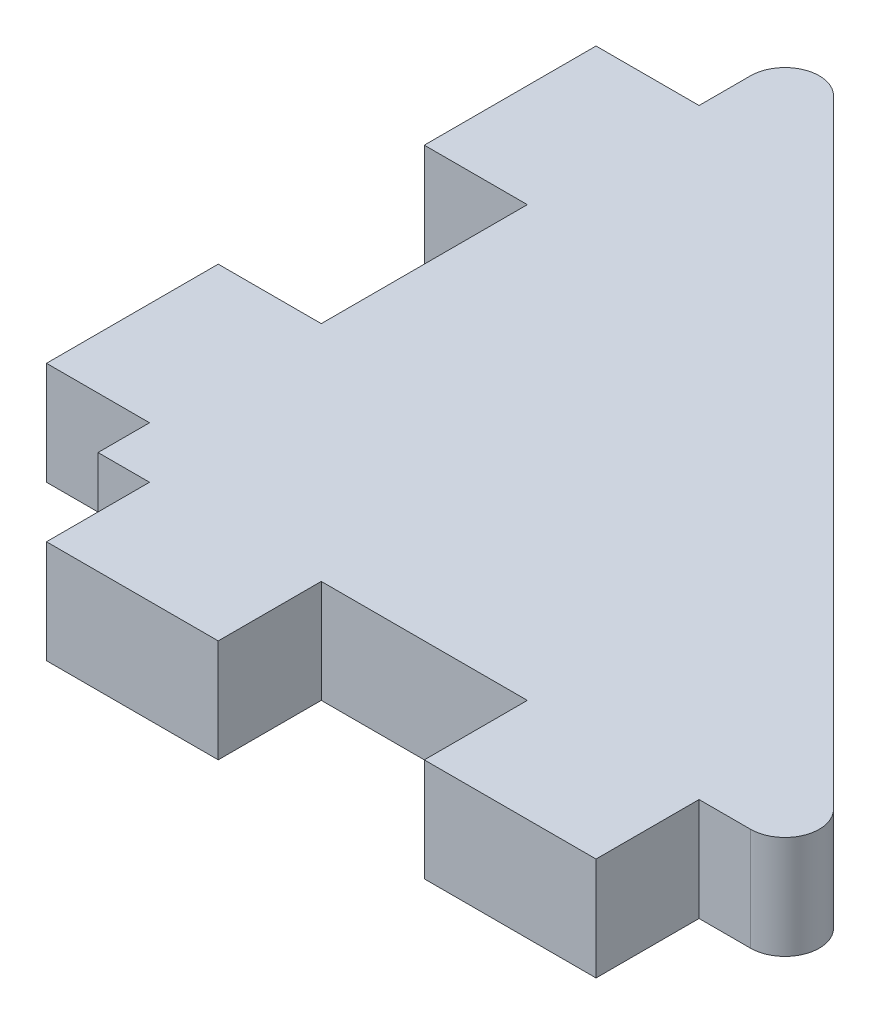
ISO-10303-21;
HEADER;
FILE_DESCRIPTION(('STEP AP214'),'2;1');
FILE_NAME('part.step','',(''),(''),'','','');
FILE_SCHEMA(('AUTOMOTIVE_DESIGN { 1 0 10303 214 1 1 1 1 }'));
ENDSEC;
DATA;
#1=APPLICATION_CONTEXT('core data for automotive mechanical design processes');
#2=APPLICATION_PROTOCOL_DEFINITION('international standard','automotive_design',2000,#1);
#3=PRODUCT_CONTEXT('',#1,'mechanical');
#4=PRODUCT('Part','Part','',(#3));
#5=PRODUCT_RELATED_PRODUCT_CATEGORY('part','',(#4));
#6=PRODUCT_DEFINITION_FORMATION('','',#4);
#7=PRODUCT_DEFINITION_CONTEXT('part definition',#1,'design');
#8=PRODUCT_DEFINITION('design','',#6,#7);
#9=PRODUCT_DEFINITION_SHAPE('','',#8);
#10=(LENGTH_UNIT() NAMED_UNIT(*) SI_UNIT(.MILLI.,.METRE.));
#11=(NAMED_UNIT(*) PLANE_ANGLE_UNIT() SI_UNIT($,.RADIAN.));
#12=(NAMED_UNIT(*) SI_UNIT($,.STERADIAN.) SOLID_ANGLE_UNIT());
#13=UNCERTAINTY_MEASURE_WITH_UNIT(LENGTH_MEASURE(1.E-05),#10,'distance_accuracy_value','');
#14=(GEOMETRIC_REPRESENTATION_CONTEXT(3) GLOBAL_UNCERTAINTY_ASSIGNED_CONTEXT((#13)) GLOBAL_UNIT_ASSIGNED_CONTEXT((#10,
#11,#12)) REPRESENTATION_CONTEXT('',''));
#15=CARTESIAN_POINT('',(0.,0.,0.));
#16=DIRECTION('',(0.,0.,1.));
#17=DIRECTION('',(1.,0.,0.));
#18=AXIS2_PLACEMENT_3D('',#15,#16,#17);
#19=CARTESIAN_POINT('',(-42.4131209888281,6.,17.2673155352754));
#20=DIRECTION('',(1.,0.,0.));
#21=DIRECTION('',(0.,0.,-1.));
#22=AXIS2_PLACEMENT_3D('',#19,#20,#21);
#23=PLANE('',#22);
#24=DIRECTION('',(0.,0.,1.));
#25=VECTOR('',#24,1.);
#26=CARTESIAN_POINT('',(-42.4131209888281,0.,17.2673155352754));
#27=LINE('',#26,#25);
#28=CARTESIAN_POINT('',(-42.4131209888281,0.,17.2673155352754));
#29=VERTEX_POINT('',#28);
#30=CARTESIAN_POINT('',(-42.4131209888281,0.,20.2673155352754));
#31=VERTEX_POINT('',#30);
#32=EDGE_CURVE('E218',#29,#31,#27,.T.);
#33=ORIENTED_EDGE('',*,*,#32,.T.);
#34=DIRECTION('',(0.,-1.,0.));
#35=VECTOR('',#34,1.);
#36=CARTESIAN_POINT('',(-42.4131209888281,6.,20.2673155352754));
#37=LINE('',#36,#35);
#38=CARTESIAN_POINT('',(-42.4131209888281,6.,20.2673155352754));
#39=VERTEX_POINT('',#38);
#40=EDGE_CURVE('E11',#39,#31,#37,.T.);
#41=ORIENTED_EDGE('',*,*,#40,.F.);
#42=DIRECTION('',(0.,0.,1.));
#43=VECTOR('',#42,1.);
#44=CARTESIAN_POINT('',(-42.4131209888281,6.,17.2673155352754));
#45=LINE('',#44,#43);
#46=CARTESIAN_POINT('',(-42.4131209888281,6.,17.2673155352754));
#47=VERTEX_POINT('',#46);
#48=EDGE_CURVE('E279',#47,#39,#45,.T.);
#49=ORIENTED_EDGE('',*,*,#48,.F.);
#50=DIRECTION('',(0.,-1.,0.));
#51=VECTOR('',#50,1.);
#52=CARTESIAN_POINT('',(-42.4131209888281,6.,17.2673155352754));
#53=LINE('',#52,#51);
#54=EDGE_CURVE('E214',#47,#29,#53,.T.);
#55=ORIENTED_EDGE('',*,*,#54,.T.);
#56=EDGE_LOOP('',(#33,#41,#49,#55));
#57=FACE_BOUND('',#56,.T.);
#58=ADVANCED_FACE('F39',(#57),#23,.F.);
#59=CARTESIAN_POINT('',(-42.4131209888281,6.,20.2673155352754));
#60=DIRECTION('',(0.,0.,-1.));
#61=DIRECTION('',(-1.,0.,0.));
#62=AXIS2_PLACEMENT_3D('',#59,#60,#61);
#63=PLANE('',#62);
#64=DIRECTION('',(1.,0.,0.));
#65=VECTOR('',#64,1.);
#66=CARTESIAN_POINT('',(-42.4131209888281,0.,20.2673155352754));
#67=LINE('',#66,#65);
#68=CARTESIAN_POINT('',(-39.4131209888281,0.,20.2673155352754));
#69=VERTEX_POINT('',#68);
#70=EDGE_CURVE('E222',#31,#69,#67,.T.);
#71=ORIENTED_EDGE('',*,*,#70,.T.);
#72=DIRECTION('',(0.,-1.,0.));
#73=VECTOR('',#72,1.);
#74=CARTESIAN_POINT('',(-39.4131209888281,6.,20.2673155352754));
#75=LINE('',#74,#73);
#76=CARTESIAN_POINT('',(-39.4131209888281,6.,20.2673155352754));
#77=VERTEX_POINT('',#76);
#78=EDGE_CURVE('E48',#77,#69,#75,.T.);
#79=ORIENTED_EDGE('',*,*,#78,.F.);
#80=DIRECTION('',(1.,0.,0.));
#81=VECTOR('',#80,1.);
#82=CARTESIAN_POINT('',(-42.4131209888281,6.,20.2673155352754));
#83=LINE('',#82,#81);
#84=EDGE_CURVE('E138',#39,#77,#83,.T.);
#85=ORIENTED_EDGE('',*,*,#84,.F.);
#86=ORIENTED_EDGE('',*,*,#40,.T.);
#87=EDGE_LOOP('',(#71,#79,#85,#86));
#88=FACE_BOUND('',#87,.T.);
#89=ADVANCED_FACE('F436',(#88),#63,.F.);
#90=CARTESIAN_POINT('',(-39.4131209888281,6.,20.2673155352754));
#91=DIRECTION('',(1.,0.,0.));
#92=DIRECTION('',(0.,0.,-1.));
#93=AXIS2_PLACEMENT_3D('',#90,#91,#92);
#94=PLANE('',#93);
#95=DIRECTION('',(0.,0.,1.));
#96=VECTOR('',#95,1.);
#97=CARTESIAN_POINT('',(-39.4131209888281,0.,20.2673155352754));
#98=LINE('',#97,#96);
#99=CARTESIAN_POINT('',(-39.4131209888281,0.,26.2673155352754));
#100=VERTEX_POINT('',#99);
#101=EDGE_CURVE('E225',#69,#100,#98,.T.);
#102=ORIENTED_EDGE('',*,*,#101,.T.);
#103=DIRECTION('',(0.,-1.,0.));
#104=VECTOR('',#103,1.);
#105=CARTESIAN_POINT('',(-39.4131209888281,6.,26.2673155352754));
#106=LINE('',#105,#104);
#107=CARTESIAN_POINT('',(-39.4131209888281,6.,26.2673155352754));
#108=VERTEX_POINT('',#107);
#109=EDGE_CURVE('E342',#108,#100,#106,.T.);
#110=ORIENTED_EDGE('',*,*,#109,.F.);
#111=DIRECTION('',(0.,0.,1.));
#112=VECTOR('',#111,1.);
#113=CARTESIAN_POINT('',(-39.4131209888281,6.,20.2673155352754));
#114=LINE('',#113,#112);
#115=EDGE_CURVE('E352',#77,#108,#114,.T.);
#116=ORIENTED_EDGE('',*,*,#115,.F.);
#117=ORIENTED_EDGE('',*,*,#78,.T.);
#118=EDGE_LOOP('',(#102,#110,#116,#117));
#119=FACE_BOUND('',#118,.T.);
#120=ADVANCED_FACE('F350',(#119),#94,.F.);
#121=CARTESIAN_POINT('',(-39.4131209888281,6.,26.2673155352754));
#122=DIRECTION('',(0.,0.,-1.));
#123=DIRECTION('',(-1.,0.,0.));
#124=AXIS2_PLACEMENT_3D('',#121,#122,#123);
#125=PLANE('',#124);
#126=DIRECTION('',(1.,0.,0.));
#127=VECTOR('',#126,1.);
#128=CARTESIAN_POINT('',(-39.4131209888281,0.,26.2673155352754));
#129=LINE('',#128,#127);
#130=CARTESIAN_POINT('',(-29.4131209888281,0.,26.2673155352754));
#131=VERTEX_POINT('',#130);
#132=EDGE_CURVE('E228',#100,#131,#129,.T.);
#133=ORIENTED_EDGE('',*,*,#132,.T.);
#134=DIRECTION('',(0.,-1.,0.));
#135=VECTOR('',#134,1.);
#136=CARTESIAN_POINT('',(-29.4131209888281,6.,26.2673155352754));
#137=LINE('',#136,#135);
#138=CARTESIAN_POINT('',(-29.4131209888281,6.,26.2673155352754));
#139=VERTEX_POINT('',#138);
#140=EDGE_CURVE('E338',#139,#131,#137,.T.);
#141=ORIENTED_EDGE('',*,*,#140,.F.);
#142=DIRECTION('',(1.,0.,0.));
#143=VECTOR('',#142,1.);
#144=CARTESIAN_POINT('',(-39.4131209888281,6.,26.2673155352754));
#145=LINE('',#144,#143);
#146=EDGE_CURVE('E371',#108,#139,#145,.T.);
#147=ORIENTED_EDGE('',*,*,#146,.F.);
#148=ORIENTED_EDGE('',*,*,#109,.T.);
#149=EDGE_LOOP('',(#133,#141,#147,#148));
#150=FACE_BOUND('',#149,.T.);
#151=ADVANCED_FACE('F361',(#150),#125,.F.);
#152=CARTESIAN_POINT('',(-29.4131209888281,6.,20.2673155352754));
#153=DIRECTION('',(-1.,0.,0.));
#154=DIRECTION('',(0.,0.,1.));
#155=AXIS2_PLACEMENT_3D('',#152,#153,#154);
#156=PLANE('',#155);
#157=DIRECTION('',(0.,0.,-1.));
#158=VECTOR('',#157,1.);
#159=CARTESIAN_POINT('',(-29.4131209888281,0.,20.2673155352754));
#160=LINE('',#159,#158);
#161=CARTESIAN_POINT('',(-29.4131209888281,0.,20.2673155352754));
#162=VERTEX_POINT('',#161);
#163=EDGE_CURVE('E231',#131,#162,#160,.T.);
#164=ORIENTED_EDGE('',*,*,#163,.T.);
#165=DIRECTION('',(0.,-1.,0.));
#166=VECTOR('',#165,1.);
#167=CARTESIAN_POINT('',(-29.4131209888281,6.,20.2673155352754));
#168=LINE('',#167,#166);
#169=CARTESIAN_POINT('',(-29.4131209888281,6.,20.2673155352754));
#170=VERTEX_POINT('',#169);
#171=EDGE_CURVE('E334',#170,#162,#168,.T.);
#172=ORIENTED_EDGE('',*,*,#171,.F.);
#173=DIRECTION('',(0.,0.,-1.));
#174=VECTOR('',#173,1.);
#175=CARTESIAN_POINT('',(-29.4131209888281,6.,20.2673155352754));
#176=LINE('',#175,#174);
#177=EDGE_CURVE('E367',#139,#170,#176,.T.);
#178=ORIENTED_EDGE('',*,*,#177,.F.);
#179=ORIENTED_EDGE('',*,*,#140,.T.);
#180=EDGE_LOOP('',(#164,#172,#178,#179));
#181=FACE_BOUND('',#180,.T.);
#182=ADVANCED_FACE('F365',(#181),#156,.F.);
#183=CARTESIAN_POINT('',(-29.4131209888281,6.,20.2673155352754));
#184=DIRECTION('',(0.,0.,-1.));
#185=DIRECTION('',(-1.,0.,0.));
#186=AXIS2_PLACEMENT_3D('',#183,#184,#185);
#187=PLANE('',#186);
#188=DIRECTION('',(1.,0.,0.));
#189=VECTOR('',#188,1.);
#190=CARTESIAN_POINT('',(-29.4131209888281,0.,20.2673155352754));
#191=LINE('',#190,#189);
#192=CARTESIAN_POINT('',(-17.4131209888281,0.,20.2673155352754));
#193=VERTEX_POINT('',#192);
#194=EDGE_CURVE('E234',#162,#193,#191,.T.);
#195=ORIENTED_EDGE('',*,*,#194,.T.);
#196=DIRECTION('',(0.,-1.,0.));
#197=VECTOR('',#196,1.);
#198=CARTESIAN_POINT('',(-17.4131209888281,6.,20.2673155352754));
#199=LINE('',#198,#197);
#200=CARTESIAN_POINT('',(-17.4131209888281,6.,20.2673155352754));
#201=VERTEX_POINT('',#200);
#202=EDGE_CURVE('E330',#201,#193,#199,.T.);
#203=ORIENTED_EDGE('',*,*,#202,.F.);
#204=DIRECTION('',(1.,0.,0.));
#205=VECTOR('',#204,1.);
#206=CARTESIAN_POINT('',(-29.4131209888281,6.,20.2673155352754));
#207=LINE('',#206,#205);
#208=EDGE_CURVE('E370',#170,#201,#207,.T.);
#209=ORIENTED_EDGE('',*,*,#208,.F.);
#210=ORIENTED_EDGE('',*,*,#171,.T.);
#211=EDGE_LOOP('',(#195,#203,#209,#210));
#212=FACE_BOUND('',#211,.T.);
#213=ADVANCED_FACE('F449',(#212),#187,.F.);
#214=CARTESIAN_POINT('',(-17.4131209888281,6.,20.2673155352754));
#215=DIRECTION('',(1.,0.,0.));
#216=DIRECTION('',(0.,0.,-1.));
#217=AXIS2_PLACEMENT_3D('',#214,#215,#216);
#218=PLANE('',#217);
#219=DIRECTION('',(0.,0.,1.));
#220=VECTOR('',#219,1.);
#221=CARTESIAN_POINT('',(-17.4131209888281,0.,20.2673155352754));
#222=LINE('',#221,#220);
#223=CARTESIAN_POINT('',(-17.4131209888281,0.,26.2673155352754));
#224=VERTEX_POINT('',#223);
#225=EDGE_CURVE('E237',#193,#224,#222,.T.);
#226=ORIENTED_EDGE('',*,*,#225,.T.);
#227=DIRECTION('',(0.,-1.,0.));
#228=VECTOR('',#227,1.);
#229=CARTESIAN_POINT('',(-17.4131209888281,6.,26.2673155352754));
#230=LINE('',#229,#228);
#231=CARTESIAN_POINT('',(-17.4131209888281,6.,26.2673155352754));
#232=VERTEX_POINT('',#231);
#233=EDGE_CURVE('E326',#232,#224,#230,.T.);
#234=ORIENTED_EDGE('',*,*,#233,.F.);
#235=DIRECTION('',(0.,0.,1.));
#236=VECTOR('',#235,1.);
#237=CARTESIAN_POINT('',(-17.4131209888281,6.,20.2673155352754));
#238=LINE('',#237,#236);
#239=EDGE_CURVE('E375',#201,#232,#238,.T.);
#240=ORIENTED_EDGE('',*,*,#239,.F.);
#241=ORIENTED_EDGE('',*,*,#202,.T.);
#242=EDGE_LOOP('',(#226,#234,#240,#241));
#243=FACE_BOUND('',#242,.T.);
#244=ADVANCED_FACE('F452',(#243),#218,.F.);
#245=CARTESIAN_POINT('',(-17.4131209888281,6.,26.2673155352754));
#246=DIRECTION('',(0.,0.,-1.));
#247=DIRECTION('',(-1.,0.,0.));
#248=AXIS2_PLACEMENT_3D('',#245,#246,#247);
#249=PLANE('',#248);
#250=DIRECTION('',(1.,0.,0.));
#251=VECTOR('',#250,1.);
#252=CARTESIAN_POINT('',(-17.4131209888281,0.,26.2673155352754));
#253=LINE('',#252,#251);
#254=CARTESIAN_POINT('',(-7.41312098882813,0.,26.2673155352754));
#255=VERTEX_POINT('',#254);
#256=EDGE_CURVE('E240',#224,#255,#253,.T.);
#257=ORIENTED_EDGE('',*,*,#256,.T.);
#258=DIRECTION('',(0.,-1.,0.));
#259=VECTOR('',#258,1.);
#260=CARTESIAN_POINT('',(-7.41312098882813,6.,26.2673155352754));
#261=LINE('',#260,#259);
#262=CARTESIAN_POINT('',(-7.41312098882813,6.,26.2673155352754));
#263=VERTEX_POINT('',#262);
#264=EDGE_CURVE('E322',#263,#255,#261,.T.);
#265=ORIENTED_EDGE('',*,*,#264,.F.);
#266=DIRECTION('',(1.,0.,0.));
#267=VECTOR('',#266,1.);
#268=CARTESIAN_POINT('',(-17.4131209888281,6.,26.2673155352754));
#269=LINE('',#268,#267);
#270=EDGE_CURVE('E382',#232,#263,#269,.T.);
#271=ORIENTED_EDGE('',*,*,#270,.F.);
#272=ORIENTED_EDGE('',*,*,#233,.T.);
#273=EDGE_LOOP('',(#257,#265,#271,#272));
#274=FACE_BOUND('',#273,.T.);
#275=ADVANCED_FACE('F456',(#274),#249,.F.);
#276=CARTESIAN_POINT('',(-7.41312098882812,6.,20.2673155352754));
#277=DIRECTION('',(-1.,0.,0.));
#278=DIRECTION('',(0.,0.,1.));
#279=AXIS2_PLACEMENT_3D('',#276,#277,#278);
#280=PLANE('',#279);
#281=DIRECTION('',(0.,0.,-1.));
#282=VECTOR('',#281,1.);
#283=CARTESIAN_POINT('',(-7.41312098882812,0.,20.2673155352754));
#284=LINE('',#283,#282);
#285=CARTESIAN_POINT('',(-7.41312098882812,0.,20.2673155352754));
#286=VERTEX_POINT('',#285);
#287=EDGE_CURVE('E243',#255,#286,#284,.T.);
#288=ORIENTED_EDGE('',*,*,#287,.T.);
#289=DIRECTION('',(0.,-1.,0.));
#290=VECTOR('',#289,1.);
#291=CARTESIAN_POINT('',(-7.41312098882812,6.,20.2673155352754));
#292=LINE('',#291,#290);
#293=CARTESIAN_POINT('',(-7.41312098882812,6.,20.2673155352754));
#294=VERTEX_POINT('',#293);
#295=EDGE_CURVE('E318',#294,#286,#292,.T.);
#296=ORIENTED_EDGE('',*,*,#295,.F.);
#297=DIRECTION('',(0.,0.,-1.));
#298=VECTOR('',#297,1.);
#299=CARTESIAN_POINT('',(-7.41312098882812,6.,20.2673155352754));
#300=LINE('',#299,#298);
#301=EDGE_CURVE('E385',#263,#294,#300,.T.);
#302=ORIENTED_EDGE('',*,*,#301,.F.);
#303=ORIENTED_EDGE('',*,*,#264,.T.);
#304=EDGE_LOOP('',(#288,#296,#302,#303));
#305=FACE_BOUND('',#304,.T.);
#306=ADVANCED_FACE('F460',(#305),#280,.F.);
#307=CARTESIAN_POINT('',(-7.41312098882812,6.,20.2673155352754));
#308=DIRECTION('',(0.,0.,-1.));
#309=DIRECTION('',(-1.,0.,0.));
#310=AXIS2_PLACEMENT_3D('',#307,#308,#309);
#311=PLANE('',#310);
#312=DIRECTION('',(1.,0.,0.));
#313=VECTOR('',#312,1.);
#314=CARTESIAN_POINT('',(-7.41312098882812,0.,20.2673155352754));
#315=LINE('',#314,#313);
#316=CARTESIAN_POINT('',(-4.41312098882813,0.,20.2673155352754));
#317=VERTEX_POINT('',#316);
#318=EDGE_CURVE('E246',#286,#317,#315,.T.);
#319=ORIENTED_EDGE('',*,*,#318,.T.);
#320=DIRECTION('',(0.,-1.,0.));
#321=VECTOR('',#320,1.);
#322=CARTESIAN_POINT('',(-4.41312098882813,6.,20.2673155352754));
#323=LINE('',#322,#321);
#324=CARTESIAN_POINT('',(-4.41312098882813,6.,20.2673155352754));
#325=VERTEX_POINT('',#324);
#326=EDGE_CURVE('E314',#325,#317,#323,.T.);
#327=ORIENTED_EDGE('',*,*,#326,.F.);
#328=DIRECTION('',(1.,0.,0.));
#329=VECTOR('',#328,1.);
#330=CARTESIAN_POINT('',(-7.41312098882812,6.,20.2673155352754));
#331=LINE('',#330,#329);
#332=EDGE_CURVE('E388',#294,#325,#331,.T.);
#333=ORIENTED_EDGE('',*,*,#332,.F.);
#334=ORIENTED_EDGE('',*,*,#295,.T.);
#335=EDGE_LOOP('',(#319,#327,#333,#334));
#336=FACE_BOUND('',#335,.T.);
#337=ADVANCED_FACE('F464',(#336),#311,.F.);
#338=CARTESIAN_POINT('',(-4.41312098882813,6.,18.2673155352754));
#339=DIRECTION('',(0.,-1.,0.));
#340=DIRECTION('',(0.,0.,-1.));
#341=AXIS2_PLACEMENT_3D('',#338,#339,#340);
#342=CYLINDRICAL_SURFACE('',#341,2.);
#343=CARTESIAN_POINT('',(-4.41312098882813,0.,18.2673155352754));
#344=DIRECTION('',(0.,1.,0.));
#345=DIRECTION('',(0.,0.,1.));
#346=AXIS2_PLACEMENT_3D('',#343,#344,#345);
#347=CIRCLE('',#346,2.);
#348=CARTESIAN_POINT('',(-2.99890742645503,0.,16.8531019729023));
#349=VERTEX_POINT('',#348);
#350=EDGE_CURVE('E249',#317,#349,#347,.T.);
#351=ORIENTED_EDGE('',*,*,#350,.T.);
#352=DIRECTION('',(0.,-1.,0.));
#353=VECTOR('',#352,1.);
#354=CARTESIAN_POINT('',(-2.99890742645503,6.,16.8531019729023));
#355=LINE('',#354,#353);
#356=CARTESIAN_POINT('',(-2.99890742645503,6.,16.8531019729023));
#357=VERTEX_POINT('',#356);
#358=EDGE_CURVE('E310',#357,#349,#355,.T.);
#359=ORIENTED_EDGE('',*,*,#358,.F.);
#360=CARTESIAN_POINT('',(-4.41312098882813,6.,18.2673155352754));
#361=DIRECTION('',(0.,1.,0.));
#362=DIRECTION('',(0.,0.,1.));
#363=AXIS2_PLACEMENT_3D('',#360,#361,#362);
#364=CIRCLE('',#363,2.);
#365=EDGE_CURVE('E391',#325,#357,#364,.T.);
#366=ORIENTED_EDGE('',*,*,#365,.F.);
#367=ORIENTED_EDGE('',*,*,#326,.T.);
#368=EDGE_LOOP('',(#351,#359,#366,#367));
#369=FACE_BOUND('',#368,.T.);
#370=ADVANCED_FACE('F468',(#369),#342,.T.);
#371=CARTESIAN_POINT('',(-38.998907426455,6.,-19.1468980270977));
#372=DIRECTION('',(-0.707106781186548,0.,0.707106781186548));
#373=DIRECTION('',(0.707106781186548,0.,0.707106781186548));
#374=AXIS2_PLACEMENT_3D('',#371,#372,#373);
#375=PLANE('',#374);
#376=DIRECTION('',(-0.707106781186547,0.,-0.707106781186547));
#377=VECTOR('',#376,1.);
#378=CARTESIAN_POINT('',(-38.998907426455,0.,-19.1468980270977));
#379=LINE('',#378,#377);
#380=CARTESIAN_POINT('',(-38.998907426455,0.,-19.1468980270977));
#381=VERTEX_POINT('',#380);
#382=EDGE_CURVE('E252',#349,#381,#379,.T.);
#383=ORIENTED_EDGE('',*,*,#382,.T.);
#384=DIRECTION('',(0.,-1.,0.));
#385=VECTOR('',#384,1.);
#386=CARTESIAN_POINT('',(-38.998907426455,6.,-19.1468980270977));
#387=LINE('',#386,#385);
#388=CARTESIAN_POINT('',(-38.998907426455,6.,-19.1468980270977));
#389=VERTEX_POINT('',#388);
#390=EDGE_CURVE('E306',#389,#381,#387,.T.);
#391=ORIENTED_EDGE('',*,*,#390,.F.);
#392=DIRECTION('',(-0.707106781186547,0.,-0.707106781186547));
#393=VECTOR('',#392,1.);
#394=CARTESIAN_POINT('',(-38.998907426455,6.,-19.1468980270977));
#395=LINE('',#394,#393);
#396=EDGE_CURVE('E394',#357,#389,#395,.T.);
#397=ORIENTED_EDGE('',*,*,#396,.F.);
#398=ORIENTED_EDGE('',*,*,#358,.T.);
#399=EDGE_LOOP('',(#383,#391,#397,#398));
#400=FACE_BOUND('',#399,.T.);
#401=ADVANCED_FACE('F472',(#400),#375,.F.);
#402=CARTESIAN_POINT('',(-40.4131209888281,6.,-17.7326844647246));
#403=DIRECTION('',(0.,-1.,0.));
#404=DIRECTION('',(0.,0.,-1.));
#405=AXIS2_PLACEMENT_3D('',#402,#403,#404);
#406=CYLINDRICAL_SURFACE('',#405,2.);
#407=CARTESIAN_POINT('',(-40.4131209888281,0.,-17.7326844647246));
#408=DIRECTION('',(0.,1.,0.));
#409=DIRECTION('',(0.,0.,1.));
#410=AXIS2_PLACEMENT_3D('',#407,#408,#409);
#411=CIRCLE('',#410,2.);
#412=CARTESIAN_POINT('',(-42.4131209888281,0.,-17.7326844647246));
#413=VERTEX_POINT('',#412);
#414=EDGE_CURVE('E255',#381,#413,#411,.T.);
#415=ORIENTED_EDGE('',*,*,#414,.T.);
#416=DIRECTION('',(0.,-1.,0.));
#417=VECTOR('',#416,1.);
#418=CARTESIAN_POINT('',(-42.4131209888281,6.,-17.7326844647246));
#419=LINE('',#418,#417);
#420=CARTESIAN_POINT('',(-42.4131209888281,6.,-17.7326844647246));
#421=VERTEX_POINT('',#420);
#422=EDGE_CURVE('E302',#421,#413,#419,.T.);
#423=ORIENTED_EDGE('',*,*,#422,.F.);
#424=CARTESIAN_POINT('',(-40.4131209888281,6.,-17.7326844647246));
#425=DIRECTION('',(0.,1.,0.));
#426=DIRECTION('',(0.,0.,1.));
#427=AXIS2_PLACEMENT_3D('',#424,#425,#426);
#428=CIRCLE('',#427,2.);
#429=EDGE_CURVE('E397',#389,#421,#428,.T.);
#430=ORIENTED_EDGE('',*,*,#429,.F.);
#431=ORIENTED_EDGE('',*,*,#390,.T.);
#432=EDGE_LOOP('',(#415,#423,#430,#431));
#433=FACE_BOUND('',#432,.T.);
#434=ADVANCED_FACE('F476',(#433),#406,.T.);
#435=CARTESIAN_POINT('',(-42.4131209888281,6.,-17.7326844647246));
#436=DIRECTION('',(1.,0.,0.));
#437=DIRECTION('',(0.,0.,-1.));
#438=AXIS2_PLACEMENT_3D('',#435,#436,#437);
#439=PLANE('',#438);
#440=DIRECTION('',(0.,0.,1.));
#441=VECTOR('',#440,1.);
#442=CARTESIAN_POINT('',(-42.4131209888281,0.,-17.7326844647246));
#443=LINE('',#442,#441);
#444=CARTESIAN_POINT('',(-42.4131209888281,0.,-14.7326844647246));
#445=VERTEX_POINT('',#444);
#446=EDGE_CURVE('E258',#413,#445,#443,.T.);
#447=ORIENTED_EDGE('',*,*,#446,.T.);
#448=DIRECTION('',(0.,-1.,0.));
#449=VECTOR('',#448,1.);
#450=CARTESIAN_POINT('',(-42.4131209888281,6.,-14.7326844647246));
#451=LINE('',#450,#449);
#452=CARTESIAN_POINT('',(-42.4131209888281,6.,-14.7326844647246));
#453=VERTEX_POINT('',#452);
#454=EDGE_CURVE('E298',#453,#445,#451,.T.);
#455=ORIENTED_EDGE('',*,*,#454,.F.);
#456=DIRECTION('',(0.,0.,1.));
#457=VECTOR('',#456,1.);
#458=CARTESIAN_POINT('',(-42.4131209888281,6.,-17.7326844647246));
#459=LINE('',#458,#457);
#460=EDGE_CURVE('E400',#421,#453,#459,.T.);
#461=ORIENTED_EDGE('',*,*,#460,.F.);
#462=ORIENTED_EDGE('',*,*,#422,.T.);
#463=EDGE_LOOP('',(#447,#455,#461,#462));
#464=FACE_BOUND('',#463,.T.);
#465=ADVANCED_FACE('F480',(#464),#439,.F.);
#466=CARTESIAN_POINT('',(-42.4131209888281,6.,-14.7326844647246));
#467=DIRECTION('',(0.,0.,1.));
#468=DIRECTION('',(1.,0.,0.));
#469=AXIS2_PLACEMENT_3D('',#466,#467,#468);
#470=PLANE('',#469);
#471=DIRECTION('',(-1.,0.,0.));
#472=VECTOR('',#471,1.);
#473=CARTESIAN_POINT('',(-42.4131209888281,0.,-14.7326844647246));
#474=LINE('',#473,#472);
#475=CARTESIAN_POINT('',(-48.4131209888281,0.,-14.7326844647246));
#476=VERTEX_POINT('',#475);
#477=EDGE_CURVE('E261',#445,#476,#474,.T.);
#478=ORIENTED_EDGE('',*,*,#477,.T.);
#479=DIRECTION('',(0.,-1.,0.));
#480=VECTOR('',#479,1.);
#481=CARTESIAN_POINT('',(-48.4131209888281,6.,-14.7326844647246));
#482=LINE('',#481,#480);
#483=CARTESIAN_POINT('',(-48.4131209888281,6.,-14.7326844647246));
#484=VERTEX_POINT('',#483);
#485=EDGE_CURVE('E294',#484,#476,#482,.T.);
#486=ORIENTED_EDGE('',*,*,#485,.F.);
#487=DIRECTION('',(-1.,0.,0.));
#488=VECTOR('',#487,1.);
#489=CARTESIAN_POINT('',(-42.4131209888281,6.,-14.7326844647246));
#490=LINE('',#489,#488);
#491=EDGE_CURVE('E403',#453,#484,#490,.T.);
#492=ORIENTED_EDGE('',*,*,#491,.F.);
#493=ORIENTED_EDGE('',*,*,#454,.T.);
#494=EDGE_LOOP('',(#478,#486,#492,#493));
#495=FACE_BOUND('',#494,.T.);
#496=ADVANCED_FACE('F484',(#495),#470,.F.);
#497=CARTESIAN_POINT('',(-48.4131209888281,6.,-14.7326844647246));
#498=DIRECTION('',(1.,0.,0.));
#499=DIRECTION('',(0.,0.,-1.));
#500=AXIS2_PLACEMENT_3D('',#497,#498,#499);
#501=PLANE('',#500);
#502=DIRECTION('',(0.,0.,1.));
#503=VECTOR('',#502,1.);
#504=CARTESIAN_POINT('',(-48.4131209888281,0.,-14.7326844647246));
#505=LINE('',#504,#503);
#506=CARTESIAN_POINT('',(-48.4131209888281,0.,-4.7326844647246));
#507=VERTEX_POINT('',#506);
#508=EDGE_CURVE('E264',#476,#507,#505,.T.);
#509=ORIENTED_EDGE('',*,*,#508,.T.);
#510=DIRECTION('',(0.,-1.,0.));
#511=VECTOR('',#510,1.);
#512=CARTESIAN_POINT('',(-48.4131209888281,6.,-4.7326844647246));
#513=LINE('',#512,#511);
#514=CARTESIAN_POINT('',(-48.4131209888281,6.,-4.7326844647246));
#515=VERTEX_POINT('',#514);
#516=EDGE_CURVE('E290',#515,#507,#513,.T.);
#517=ORIENTED_EDGE('',*,*,#516,.F.);
#518=DIRECTION('',(0.,0.,1.));
#519=VECTOR('',#518,1.);
#520=CARTESIAN_POINT('',(-48.4131209888281,6.,-14.7326844647246));
#521=LINE('',#520,#519);
#522=EDGE_CURVE('E406',#484,#515,#521,.T.);
#523=ORIENTED_EDGE('',*,*,#522,.F.);
#524=ORIENTED_EDGE('',*,*,#485,.T.);
#525=EDGE_LOOP('',(#509,#517,#523,#524));
#526=FACE_BOUND('',#525,.T.);
#527=ADVANCED_FACE('F488',(#526),#501,.F.);
#528=CARTESIAN_POINT('',(-42.4131209888281,6.,-4.7326844647246));
#529=DIRECTION('',(0.,0.,-1.));
#530=DIRECTION('',(-1.,0.,0.));
#531=AXIS2_PLACEMENT_3D('',#528,#529,#530);
#532=PLANE('',#531);
#533=DIRECTION('',(1.,0.,0.));
#534=VECTOR('',#533,1.);
#535=CARTESIAN_POINT('',(-42.4131209888281,0.,-4.7326844647246));
#536=LINE('',#535,#534);
#537=CARTESIAN_POINT('',(-42.4131209888281,0.,-4.7326844647246));
#538=VERTEX_POINT('',#537);
#539=EDGE_CURVE('E267',#507,#538,#536,.T.);
#540=ORIENTED_EDGE('',*,*,#539,.T.);
#541=DIRECTION('',(0.,-1.,0.));
#542=VECTOR('',#541,1.);
#543=CARTESIAN_POINT('',(-42.4131209888281,6.,-4.7326844647246));
#544=LINE('',#543,#542);
#545=CARTESIAN_POINT('',(-42.4131209888281,6.,-4.7326844647246));
#546=VERTEX_POINT('',#545);
#547=EDGE_CURVE('E286',#546,#538,#544,.T.);
#548=ORIENTED_EDGE('',*,*,#547,.F.);
#549=DIRECTION('',(1.,0.,0.));
#550=VECTOR('',#549,1.);
#551=CARTESIAN_POINT('',(-42.4131209888281,6.,-4.7326844647246));
#552=LINE('',#551,#550);
#553=EDGE_CURVE('E409',#515,#546,#552,.T.);
#554=ORIENTED_EDGE('',*,*,#553,.F.);
#555=ORIENTED_EDGE('',*,*,#516,.T.);
#556=EDGE_LOOP('',(#540,#548,#554,#555));
#557=FACE_BOUND('',#556,.T.);
#558=ADVANCED_FACE('F417',(#557),#532,.F.);
#559=CARTESIAN_POINT('',(-42.4131209888281,6.,-4.7326844647246));
#560=DIRECTION('',(1.,0.,0.));
#561=DIRECTION('',(0.,0.,-1.));
#562=AXIS2_PLACEMENT_3D('',#559,#560,#561);
#563=PLANE('',#562);
#564=DIRECTION('',(0.,0.,1.));
#565=VECTOR('',#564,1.);
#566=CARTESIAN_POINT('',(-42.4131209888281,0.,-4.7326844647246));
#567=LINE('',#566,#565);
#568=CARTESIAN_POINT('',(-42.4131209888281,0.,7.2673155352754));
#569=VERTEX_POINT('',#568);
#570=EDGE_CURVE('E270',#538,#569,#567,.T.);
#571=ORIENTED_EDGE('',*,*,#570,.T.);
#572=DIRECTION('',(0.,-1.,0.));
#573=VECTOR('',#572,1.);
#574=CARTESIAN_POINT('',(-42.4131209888281,6.,7.2673155352754));
#575=LINE('',#574,#573);
#576=CARTESIAN_POINT('',(-42.4131209888281,6.,7.2673155352754));
#577=VERTEX_POINT('',#576);
#578=EDGE_CURVE('E207',#577,#569,#575,.T.);
#579=ORIENTED_EDGE('',*,*,#578,.F.);
#580=DIRECTION('',(0.,0.,1.));
#581=VECTOR('',#580,1.);
#582=CARTESIAN_POINT('',(-42.4131209888281,6.,-4.7326844647246));
#583=LINE('',#582,#581);
#584=EDGE_CURVE('E196',#546,#577,#583,.T.);
#585=ORIENTED_EDGE('',*,*,#584,.F.);
#586=ORIENTED_EDGE('',*,*,#547,.T.);
#587=EDGE_LOOP('',(#571,#579,#585,#586));
#588=FACE_BOUND('',#587,.T.);
#589=ADVANCED_FACE('F421',(#588),#563,.F.);
#590=CARTESIAN_POINT('',(-42.4131209888281,6.,7.2673155352754));
#591=DIRECTION('',(0.,0.,1.));
#592=DIRECTION('',(1.,0.,0.));
#593=AXIS2_PLACEMENT_3D('',#590,#591,#592);
#594=PLANE('',#593);
#595=DIRECTION('',(-1.,0.,0.));
#596=VECTOR('',#595,1.);
#597=CARTESIAN_POINT('',(-42.4131209888281,0.,7.2673155352754));
#598=LINE('',#597,#596);
#599=CARTESIAN_POINT('',(-48.4131209888281,0.,7.2673155352754));
#600=VERTEX_POINT('',#599);
#601=EDGE_CURVE('E205',#569,#600,#598,.T.);
#602=ORIENTED_EDGE('',*,*,#601,.T.);
#603=DIRECTION('',(0.,-1.,0.));
#604=VECTOR('',#603,1.);
#605=CARTESIAN_POINT('',(-48.4131209888281,6.,7.2673155352754));
#606=LINE('',#605,#604);
#607=CARTESIAN_POINT('',(-48.4131209888281,6.,7.2673155352754));
#608=VERTEX_POINT('',#607);
#609=EDGE_CURVE('E202',#608,#600,#606,.T.);
#610=ORIENTED_EDGE('',*,*,#609,.F.);
#611=DIRECTION('',(-1.,0.,0.));
#612=VECTOR('',#611,1.);
#613=CARTESIAN_POINT('',(-42.4131209888281,6.,7.2673155352754));
#614=LINE('',#613,#612);
#615=EDGE_CURVE('E190',#577,#608,#614,.T.);
#616=ORIENTED_EDGE('',*,*,#615,.F.);
#617=ORIENTED_EDGE('',*,*,#578,.T.);
#618=EDGE_LOOP('',(#602,#610,#616,#617));
#619=FACE_BOUND('',#618,.T.);
#620=ADVANCED_FACE('F203',(#619),#594,.F.);
#621=CARTESIAN_POINT('',(-48.4131209888281,6.,7.2673155352754));
#622=DIRECTION('',(1.,0.,0.));
#623=DIRECTION('',(0.,0.,-1.));
#624=AXIS2_PLACEMENT_3D('',#621,#622,#623);
#625=PLANE('',#624);
#626=DIRECTION('',(0.,0.,1.));
#627=VECTOR('',#626,1.);
#628=CARTESIAN_POINT('',(-48.4131209888281,0.,7.2673155352754));
#629=LINE('',#628,#627);
#630=CARTESIAN_POINT('',(-48.4131209888281,0.,17.2673155352754));
#631=VERTEX_POINT('',#630);
#632=EDGE_CURVE('E124',#600,#631,#629,.T.);
#633=ORIENTED_EDGE('',*,*,#632,.T.);
#634=DIRECTION('',(0.,-1.,0.));
#635=VECTOR('',#634,1.);
#636=CARTESIAN_POINT('',(-48.4131209888281,6.,17.2673155352754));
#637=LINE('',#636,#635);
#638=CARTESIAN_POINT('',(-48.4131209888281,6.,17.2673155352754));
#639=VERTEX_POINT('',#638);
#640=EDGE_CURVE('E208',#639,#631,#637,.T.);
#641=ORIENTED_EDGE('',*,*,#640,.F.);
#642=DIRECTION('',(0.,0.,1.));
#643=VECTOR('',#642,1.);
#644=CARTESIAN_POINT('',(-48.4131209888281,6.,7.2673155352754));
#645=LINE('',#644,#643);
#646=EDGE_CURVE('E194',#608,#639,#645,.T.);
#647=ORIENTED_EDGE('',*,*,#646,.F.);
#648=ORIENTED_EDGE('',*,*,#609,.T.);
#649=EDGE_LOOP('',(#633,#641,#647,#648));
#650=FACE_BOUND('',#649,.T.);
#651=ADVANCED_FACE('F210',(#650),#625,.F.);
#652=CARTESIAN_POINT('',(-42.4131209888281,6.,17.2673155352754));
#653=DIRECTION('',(0.,0.,-1.));
#654=DIRECTION('',(-1.,0.,0.));
#655=AXIS2_PLACEMENT_3D('',#652,#653,#654);
#656=PLANE('',#655);
#657=DIRECTION('',(1.,0.,0.));
#658=VECTOR('',#657,1.);
#659=CARTESIAN_POINT('',(-42.4131209888281,0.,17.2673155352754));
#660=LINE('',#659,#658);
#661=EDGE_CURVE('E130',#631,#29,#660,.T.);
#662=ORIENTED_EDGE('',*,*,#661,.T.);
#663=ORIENTED_EDGE('',*,*,#54,.F.);
#664=DIRECTION('',(1.,0.,0.));
#665=VECTOR('',#664,1.);
#666=CARTESIAN_POINT('',(-42.4131209888281,6.,17.2673155352754));
#667=LINE('',#666,#665);
#668=EDGE_CURVE('E56',#639,#47,#667,.T.);
#669=ORIENTED_EDGE('',*,*,#668,.F.);
#670=ORIENTED_EDGE('',*,*,#640,.T.);
#671=EDGE_LOOP('',(#662,#663,#669,#670));
#672=FACE_BOUND('',#671,.T.);
#673=ADVANCED_FACE('F425',(#672),#656,.F.);
#674=CARTESIAN_POINT('',(-4.41312098882813,6.,18.2673155352754));
#675=DIRECTION('',(0.,1.,0.));
#676=DIRECTION('',(0.,0.,1.));
#677=AXIS2_PLACEMENT_3D('',#674,#675,#676);
#678=PLANE('',#677);
#679=ORIENTED_EDGE('',*,*,#48,.T.);
#680=ORIENTED_EDGE('',*,*,#84,.T.);
#681=ORIENTED_EDGE('',*,*,#115,.T.);
#682=ORIENTED_EDGE('',*,*,#146,.T.);
#683=ORIENTED_EDGE('',*,*,#177,.T.);
#684=ORIENTED_EDGE('',*,*,#208,.T.);
#685=ORIENTED_EDGE('',*,*,#239,.T.);
#686=ORIENTED_EDGE('',*,*,#270,.T.);
#687=ORIENTED_EDGE('',*,*,#301,.T.);
#688=ORIENTED_EDGE('',*,*,#332,.T.);
#689=ORIENTED_EDGE('',*,*,#365,.T.);
#690=ORIENTED_EDGE('',*,*,#396,.T.);
#691=ORIENTED_EDGE('',*,*,#429,.T.);
#692=ORIENTED_EDGE('',*,*,#460,.T.);
#693=ORIENTED_EDGE('',*,*,#491,.T.);
#694=ORIENTED_EDGE('',*,*,#522,.T.);
#695=ORIENTED_EDGE('',*,*,#553,.T.);
#696=ORIENTED_EDGE('',*,*,#584,.T.);
#697=ORIENTED_EDGE('',*,*,#615,.T.);
#698=ORIENTED_EDGE('',*,*,#646,.T.);
#699=ORIENTED_EDGE('',*,*,#668,.T.);
#700=EDGE_LOOP('',(#679,#680,#681,#682,#683,#684,#685,#686,#687,#688,#689,#690,#691,#692,#693,
#694,#695,#696,#697,#698,#699));
#701=FACE_BOUND('',#700,.T.);
#702=ADVANCED_FACE('F192',(#701),#678,.T.);
#703=CARTESIAN_POINT('',(-4.41312098882813,0.,18.2673155352754));
#704=DIRECTION('',(0.,1.,0.));
#705=DIRECTION('',(0.,0.,1.));
#706=AXIS2_PLACEMENT_3D('',#703,#704,#705);
#707=PLANE('',#706);
#708=ORIENTED_EDGE('',*,*,#32,.F.);
#709=ORIENTED_EDGE('',*,*,#661,.F.);
#710=ORIENTED_EDGE('',*,*,#632,.F.);
#711=ORIENTED_EDGE('',*,*,#601,.F.);
#712=ORIENTED_EDGE('',*,*,#570,.F.);
#713=ORIENTED_EDGE('',*,*,#539,.F.);
#714=ORIENTED_EDGE('',*,*,#508,.F.);
#715=ORIENTED_EDGE('',*,*,#477,.F.);
#716=ORIENTED_EDGE('',*,*,#446,.F.);
#717=ORIENTED_EDGE('',*,*,#414,.F.);
#718=ORIENTED_EDGE('',*,*,#382,.F.);
#719=ORIENTED_EDGE('',*,*,#350,.F.);
#720=ORIENTED_EDGE('',*,*,#318,.F.);
#721=ORIENTED_EDGE('',*,*,#287,.F.);
#722=ORIENTED_EDGE('',*,*,#256,.F.);
#723=ORIENTED_EDGE('',*,*,#225,.F.);
#724=ORIENTED_EDGE('',*,*,#194,.F.);
#725=ORIENTED_EDGE('',*,*,#163,.F.);
#726=ORIENTED_EDGE('',*,*,#132,.F.);
#727=ORIENTED_EDGE('',*,*,#101,.F.);
#728=ORIENTED_EDGE('',*,*,#70,.F.);
#729=EDGE_LOOP('',(#708,#709,#710,#711,#712,#713,#714,#715,#716,#717,#718,#719,#720,#721,#722,
#723,#724,#725,#726,#727,#728));
#730=FACE_BOUND('',#729,.T.);
#731=ADVANCED_FACE('F356',(#730),#707,.F.);
#732=CLOSED_SHELL('',(#58,#89,#120,#151,#182,#213,#244,#275,#306,#337,#370,#401,#434,#465,#496,
#527,#558,#589,#620,#651,#673,#702,#731));
#733=MANIFOLD_SOLID_BREP('B2',#732);
#734=ADVANCED_BREP_SHAPE_REPRESENTATION('',(#18,#733),#14);
#735=SHAPE_DEFINITION_REPRESENTATION(#9,#734);
ENDSEC;
END-ISO-10303-21;
